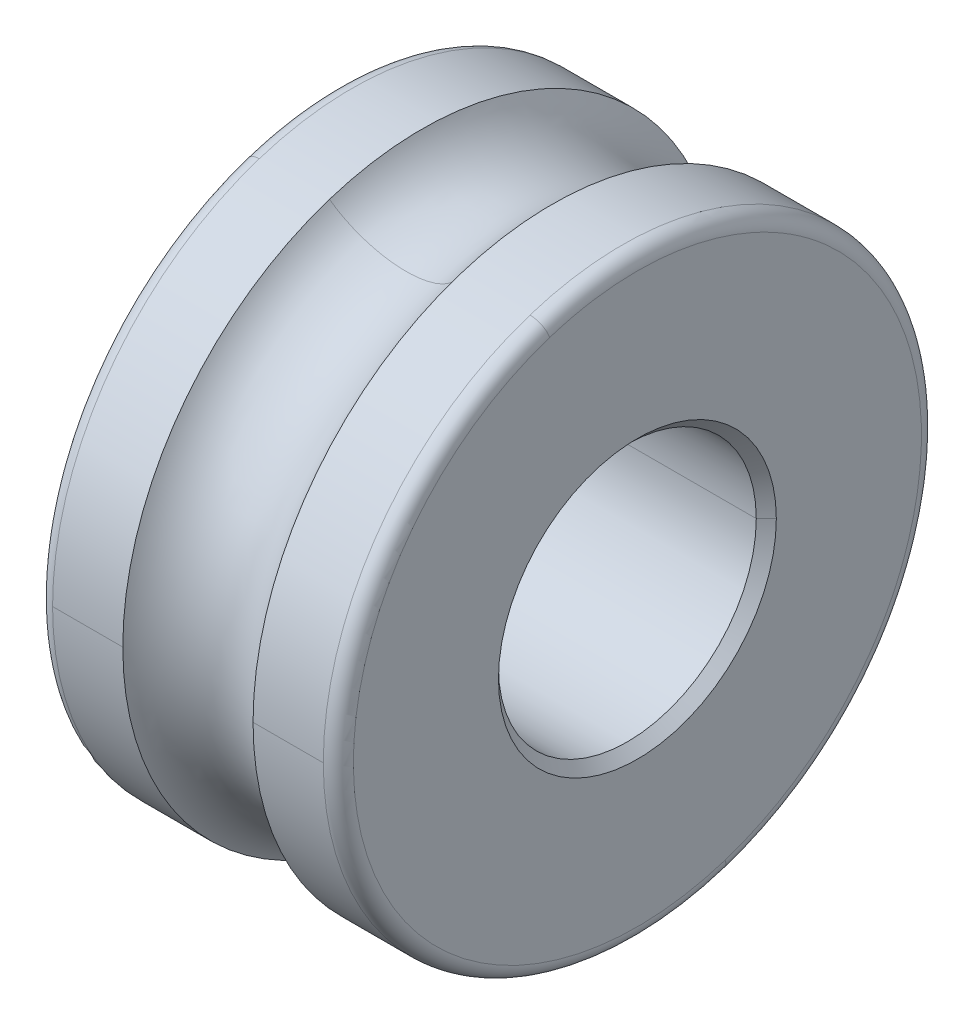
ISO-10303-21;
HEADER;
FILE_DESCRIPTION(('STEP AP214'),'2;1');
FILE_NAME('part.step','',(''),(''),'','','');
FILE_SCHEMA(('AUTOMOTIVE_DESIGN { 1 0 10303 214 1 1 1 1 }'));
ENDSEC;
DATA;
#1=APPLICATION_CONTEXT('core data for automotive mechanical design processes');
#2=APPLICATION_PROTOCOL_DEFINITION('international standard','automotive_design',2000,#1);
#3=PRODUCT_CONTEXT('',#1,'mechanical');
#4=PRODUCT('Part','Part','',(#3));
#5=PRODUCT_RELATED_PRODUCT_CATEGORY('part','',(#4));
#6=PRODUCT_DEFINITION_FORMATION('','',#4);
#7=PRODUCT_DEFINITION_CONTEXT('part definition',#1,'design');
#8=PRODUCT_DEFINITION('design','',#6,#7);
#9=PRODUCT_DEFINITION_SHAPE('','',#8);
#10=(LENGTH_UNIT() NAMED_UNIT(*) SI_UNIT(.MILLI.,.METRE.));
#11=(NAMED_UNIT(*) PLANE_ANGLE_UNIT() SI_UNIT($,.RADIAN.));
#12=(NAMED_UNIT(*) SI_UNIT($,.STERADIAN.) SOLID_ANGLE_UNIT());
#13=UNCERTAINTY_MEASURE_WITH_UNIT(LENGTH_MEASURE(1.E-05),#10,'distance_accuracy_value','');
#14=(GEOMETRIC_REPRESENTATION_CONTEXT(3) GLOBAL_UNCERTAINTY_ASSIGNED_CONTEXT((#13)) GLOBAL_UNIT_ASSIGNED_CONTEXT((#10,
#11,#12)) REPRESENTATION_CONTEXT('',''));
#15=CARTESIAN_POINT('',(0.,0.,0.));
#16=DIRECTION('',(0.,0.,1.));
#17=DIRECTION('',(1.,0.,0.));
#18=AXIS2_PLACEMENT_3D('',#15,#16,#17);
#19=CARTESIAN_POINT('',(0.,6.61,0.));
#20=DIRECTION('',(-1.,0.,0.));
#21=DIRECTION('',(0.,0.,1.));
#22=AXIS2_PLACEMENT_3D('',#19,#20,#21);
#23=PLANE('',#22);
#24=CARTESIAN_POINT('',(0.,0.,0.));
#25=DIRECTION('',(1.,0.,0.));
#26=DIRECTION('',(0.,0.,-1.));
#27=AXIS2_PLACEMENT_3D('',#24,#25,#26);
#28=CIRCLE('',#27,3.2333333333333);
#29=CARTESIAN_POINT('',(0.,0.,-3.2333333333333));
#30=VERTEX_POINT('',#29);
#31=CARTESIAN_POINT('',(0.,0.,3.2333333333333));
#32=VERTEX_POINT('',#31);
#33=EDGE_CURVE('E11',#30,#32,#28,.T.);
#34=ORIENTED_EDGE('',*,*,#33,.T.);
#35=CARTESIAN_POINT('',(0.,0.,0.));
#36=DIRECTION('',(1.,0.,0.));
#37=DIRECTION('',(0.,0.,-1.));
#38=AXIS2_PLACEMENT_3D('',#35,#36,#37);
#39=CIRCLE('',#38,3.2333333333333);
#40=EDGE_CURVE('E25',#32,#30,#39,.T.);
#41=ORIENTED_EDGE('',*,*,#40,.T.);
#42=EDGE_LOOP('',(#34,#41));
#43=FACE_BOUND('',#42,.T.);
#44=CARTESIAN_POINT('',(0.,6.28648357271096,2.04260233281842));
#45=CARTESIAN_POINT('',(0.,6.25306371841246,2.14546549257869));
#46=CARTESIAN_POINT('',(0.,6.2171150163583,2.2475067746292));
#47=CARTESIAN_POINT('',(0.,6.14025594741172,2.44970334029793));
#48=CARTESIAN_POINT('',(0.,6.09934558051929,2.54985862391613));
#49=CARTESIAN_POINT('',(0.,6.01265921256923,2.74804094970742));
#50=CARTESIAN_POINT('',(0.,5.9668832115116,2.8460679918805));
#51=CARTESIAN_POINT('',(0.,5.87057653046257,3.03975793632542));
#52=CARTESIAN_POINT('',(0.,5.82004585047117,3.13542083859726));
#53=CARTESIAN_POINT('',(0.,5.71435136303119,3.32415197399251));
#54=CARTESIAN_POINT('',(0.,5.65918755558261,3.41722020711593));
#55=CARTESIAN_POINT('',(0.,5.54435975626676,3.60053781316041));
#56=CARTESIAN_POINT('',(0.,5.4846957643995,3.69078718608148));
#57=CARTESIAN_POINT('',(0.,5.36101131900778,3.86824964812758));
#58=CARTESIAN_POINT('',(0.,5.29699086548332,3.9554627372526));
#59=CARTESIAN_POINT('',(0.,5.1647477311462,4.12664252906214));
#60=CARTESIAN_POINT('',(0.,5.09652505033354,4.21060923174664));
#61=CARTESIAN_POINT('',(0.,4.95604181489885,4.37509396717841));
#62=CARTESIAN_POINT('',(0.,4.88378126027682,4.45561199992567));
#63=CARTESIAN_POINT('',(0.,4.73539635947924,4.61300542058471));
#64=CARTESIAN_POINT('',(0.,4.65927201330369,4.68988080849649));
#65=CARTESIAN_POINT('',(0.,4.5033429195496,4.83980373991612));
#66=CARTESIAN_POINT('',(0.,4.42353817197105,4.91285128342395));
#67=CARTESIAN_POINT('',(0.,4.26044053205593,5.05494254811199));
#68=CARTESIAN_POINT('',(0.,4.17714763971937,5.12398626929219));
#69=CARTESIAN_POINT('',(0.,4.00727437015662,5.25790355695128));
#70=CARTESIAN_POINT('',(0.,3.92069399293044,5.32277712343018));
#71=CARTESIAN_POINT('',(0.,3.74445433330205,5.44819781558325));
#72=CARTESIAN_POINT('',(0.,3.65479505089984,5.50874494125743));
#73=CARTESIAN_POINT('',(0.,3.47261357798356,5.62536688847189));
#74=CARTESIAN_POINT('',(0.,3.3800913874695,5.68144171001218));
#75=CARTESIAN_POINT('',(0.,3.19240699239056,5.78898395980221));
#76=CARTESIAN_POINT('',(0.,3.09724478782568,5.84045138805197));
#77=CARTESIAN_POINT('',(0.,2.9045096187311,5.93865486171827));
#78=CARTESIAN_POINT('',(0.,2.8069366542014,5.98539090713482));
#79=CARTESIAN_POINT('',(0.,2.60961502699511,6.07401902390771));
#80=CARTESIAN_POINT('',(0.,2.50986636431852,6.11591109526406));
#81=CARTESIAN_POINT('',(0.,2.30843364408381,6.19475034224733));
#82=CARTESIAN_POINT('',(0.,2.20674958652568,6.23169751787426));
#83=CARTESIAN_POINT('',(0.,2.001691042329,6.30055796441643));
#84=CARTESIAN_POINT('',(0.,1.89831655569046,6.33247123533167));
#85=CARTESIAN_POINT('',(0.,1.6901261915258,6.39118699058555));
#86=CARTESIAN_POINT('',(0.,1.58531031399969,6.41798947492419));
#87=CARTESIAN_POINT('',(0.,1.37448967868964,6.46641908749249));
#88=CARTESIAN_POINT('',(0.,1.2684849209057,6.48804621572214));
#89=CARTESIAN_POINT('',(0.,1.05554189982644,6.52607301442623));
#90=CARTESIAN_POINT('',(0.,0.948603636531105,6.54247268490068));
#91=CARTESIAN_POINT('',(0.,0.734051228072004,6.57000505985174));
#92=CARTESIAN_POINT('',(0.,0.626437082908237,6.58113776432836));
#93=CARTESIAN_POINT('',(0.,0.410792162613851,6.59810938762359));
#94=CARTESIAN_POINT('',(0.,0.302761387483233,6.6039483064422));
#95=CARTESIAN_POINT('',(0.,0.0865434628548161,6.61031829195453));
#96=CARTESIAN_POINT('',(0.,-0.0216436866429828,6.61084935864825));
#97=CARTESIAN_POINT('',(0.,-0.237913727686547,6.60660236052464));
#98=CARTESIAN_POINT('',(0.,-0.345996619232311,6.60182429570731));
#99=CARTESIAN_POINT('',(0.,-0.561797763219132,6.58697054533824));
#100=CARTESIAN_POINT('',(0.,-0.669516015660187,6.5768948597865));
#101=CARTESIAN_POINT('',(0.,-0.88432837873245,6.55147014115763));
#102=CARTESIAN_POINT('',(0.,-0.991422489363659,6.5361211080805));
#103=CARTESIAN_POINT('',(0.,-1.20472856972338,6.50018667156596));
#104=CARTESIAN_POINT('',(0.,-1.3109405394519,6.47960126812855));
#105=CARTESIAN_POINT('',(0.,-1.52222646406809,6.43324368293338));
#106=CARTESIAN_POINT('',(0.,-1.62730041895577,6.40747150117563));
#107=CARTESIAN_POINT('',(0.,-1.83605718152957,6.35080244678302));
#108=CARTESIAN_POINT('',(0.,-1.9397399892157,6.31990557414816));
#109=CARTESIAN_POINT('',(0.,-2.14546467642113,6.25306157127376));
#110=CARTESIAN_POINT('',(0.,-2.24750655594044,6.21711444103422));
#111=CARTESIAN_POINT('',(0.,-2.44970355898668,6.1402565227358));
#112=CARTESIAN_POINT('',(0.,-2.5498586825136,6.09934573467692));
#113=CARTESIAN_POINT('',(0.,-2.74804089110994,6.01265905841161));
#114=CARTESIAN_POINT('',(0.,-2.84606797617935,5.96688317020519));
#115=CARTESIAN_POINT('',(0.,-3.03975795202656,5.87057657176898));
#116=CARTESIAN_POINT('',(0.,-3.13542084280436,5.82004586153919));
#117=CARTESIAN_POINT('',(0.,-3.3241519697854,5.71435135196317));
#118=CARTESIAN_POINT('',(0.,-3.41722020598863,5.65918755261694));
#119=CARTESIAN_POINT('',(0.,-3.6005378142877,5.54435975923243));
#120=CARTESIAN_POINT('',(0.,-3.69078718638354,5.48469576519415));
#121=CARTESIAN_POINT('',(0.,-3.86824964782552,5.36101131821313));
#122=CARTESIAN_POINT('',(0.,-3.95546273717166,5.29699086527039));
#123=CARTESIAN_POINT('',(0.,-4.12664252914307,5.16474773135913));
#124=CARTESIAN_POINT('',(0.,-4.21060923176833,5.0965250503906));
#125=CARTESIAN_POINT('',(0.,-4.37509396715672,4.9560418148418));
#126=CARTESIAN_POINT('',(0.,-4.45561199991985,4.88378126026154));
#127=CARTESIAN_POINT('',(0.,-4.61300542059051,4.73539635949453));
#128=CARTESIAN_POINT('',(0.,-4.68988080849805,4.65927201330779));
#129=CARTESIAN_POINT('',(0.,-4.83980373991455,4.5033429195455));
#130=CARTESIAN_POINT('',(0.,-4.91285128342353,4.42353817196996));
#131=CARTESIAN_POINT('',(0.,-5.0549425481124,4.26044053205704));
#132=CARTESIAN_POINT('',(0.,-5.12398626929229,4.17714763971966));
#133=CARTESIAN_POINT('',(0.,-5.25790355695117,4.00727437015633));
#134=CARTESIAN_POINT('',(0.,-5.32277712343014,3.92069399293037));
#135=CARTESIAN_POINT('',(0.,-5.44819781558328,3.74445433330213));
#136=CARTESIAN_POINT('',(0.,-5.50874494125744,3.65479505089986));
#137=CARTESIAN_POINT('',(0.,-5.62536688847188,3.47261357798355));
#138=CARTESIAN_POINT('',(0.,-5.68144171001217,3.3800913874695));
#139=CARTESIAN_POINT('',(0.,-5.78898395980221,3.19240699239058));
#140=CARTESIAN_POINT('',(0.,-5.84045138805196,3.09724478782569));
#141=CARTESIAN_POINT('',(0.,-5.93865486171827,2.90450961873111));
#142=CARTESIAN_POINT('',(0.,-5.98539090713481,2.80693665420141));
#143=CARTESIAN_POINT('',(0.,-6.07401902390772,2.60961502699511));
#144=CARTESIAN_POINT('',(0.,-6.11591109526408,2.50986636431852));
#145=CARTESIAN_POINT('',(0.,-6.19475034224731,2.30843364408382));
#146=CARTESIAN_POINT('',(0.,-6.23169751787418,2.20674958652571));
#147=CARTESIAN_POINT('',(0.,-6.30055796441651,2.00169104232899));
#148=CARTESIAN_POINT('',(0.,-6.33247123533197,1.89831655569038));
#149=CARTESIAN_POINT('',(0.,-6.39118699058525,1.69012619152589));
#150=CARTESIAN_POINT('',(0.,-6.41798947492306,1.585310314));
#151=CARTESIAN_POINT('',(0.,-6.46641908749362,1.37448967868934));
#152=CARTESIAN_POINT('',(0.,-6.48804621572637,1.26848492090456));
#153=CARTESIAN_POINT('',(0.,-6.526073014422,1.05554189982759));
#154=CARTESIAN_POINT('',(0.,-6.54247268488489,0.948603636535395));
#155=CARTESIAN_POINT('',(0.,-6.57000505986753,0.734051228067723));
#156=CARTESIAN_POINT('',(0.,-6.58113776438727,0.62643708289225));
#157=CARTESIAN_POINT('',(0.,-6.59810938756469,0.410792162629845));
#158=CARTESIAN_POINT('',(0.,-6.60394830622236,0.302761387542914));
#159=CARTESIAN_POINT('',(0.,-6.61031829217436,0.0865434627951466));
#160=CARTESIAN_POINT('',(0.,-6.61084935946868,-0.0216436868656896));
#161=CARTESIAN_POINT('',(0.,-6.60660235970422,-0.237913727463827));
#162=CARTESIAN_POINT('',(0.,-6.60182429264543,-0.345996618401128));
#163=CARTESIAN_POINT('',(0.,-6.58697054840012,-0.561797764050303));
#164=CARTESIAN_POINT('',(0.,-6.57689487121359,-0.669516018762178));
#165=CARTESIAN_POINT('',(0.,-6.55147012973054,-0.884328375630452));
#166=CARTESIAN_POINT('',(0.,-6.53612106543401,-0.991422477786851));
#167=CARTESIAN_POINT('',(0.,-6.50018671421245,-1.20472858130018));
#168=CARTESIAN_POINT('',(0.,-6.47960142728742,-1.31094058265712));
#169=CARTESIAN_POINT('',(0.,-6.43324352377452,-1.52222642086287));
#170=CARTESIAN_POINT('',(0.,-6.40747090718665,-1.62730025771168));
#171=CARTESIAN_POINT('',(0.,-6.35080304077201,-1.83605734277366));
#172=CARTESIAN_POINT('',(0.,-6.31990779094523,-1.93974059098682));
#173=CARTESIAN_POINT('',(0.,-6.28648357271096,-2.04260233281841));
#174=B_SPLINE_CURVE_WITH_KNOTS('',3,(#44,#45,#46,#47,#48,#49,#50,#51,#52,#53,#54,#55,#56,#57,
#58,#59,#60,#61,#62,#63,#64,#65,#66,#67,#68,#69,#70,#71,#72,#73,#74,#75,#76,#77,#78,#79,#80,#81,
#82,#83,#84,#85,#86,#87,#88,#89,#90,#91,#92,#93,#94,#95,#96,#97,#98,#99,#100,#101,#102,#103,
#104,#105,#106,#107,#108,#109,#110,#111,#112,#113,#114,#115,#116,#117,#118,#119,#120,#121,#122,
#123,#124,#125,#126,#127,#128,#129,#130,#131,#132,#133,#134,#135,#136,#137,#138,#139,#140,#141,
#142,#143,#144,#145,#146,#147,#148,#149,#150,#151,#152,#153,#154,#155,#156,#157,#158,#159,#160,
#161,#162,#163,#164,#165,#166,#167,#168,#169,#170,#171,#172,#173),.UNSPECIFIED.,.F.,.F.,(4,2,2,
2,2,2,2,2,2,2,2,2,2,2,2,2,2,2,2,2,2,2,2,2,2,2,2,2,2,2,2,2,2,2,2,2,2,2,2,2,2,2,2,2,2,2,2,2,2,2,2,
2,2,2,2,2,2,2,2,2,2,2,2,2,4),(0.,0.324435041072899,0.648870082145801,0.973305123218701,
1.2977401642916,1.6221752053645,1.9466102464374,2.2710452875103,2.5954803285832,2.9199153696561,
3.244350410729,3.56878545180191,3.8932204928748,4.2176555339477,4.5420905750206,
4.86652561609351,5.19096065716641,5.51539569823931,5.83983073931221,6.16426578038511,
6.48870082145801,6.81313586253091,7.13757090360381,7.46200594467671,7.78644098574961,
8.11087602682251,8.43531106789541,8.75974610896831,9.08418115004121,9.40861619111411,
9.73305123218701,10.0574862732599,10.3819213143328,10.7063563554057,11.0307913964786,
11.3552264375515,11.6796614786244,12.0040965196973,12.3285315607702,12.6529666018431,
12.977401642916,13.3018366839889,13.6262717250618,13.9507067661347,14.2751418072076,
14.5995768482805,14.9240118893534,15.2484469304263,15.5728819714992,15.8973170125721,
16.221752053645,16.5461870947179,16.8706221357908,17.1950571768637,17.5194922179366,
17.8439272590095,18.1683623000824,18.4927973411553,18.8172323822282,19.1416674233011,
19.466102464374,19.7905375054469,20.1149725465198,20.4394075875927,20.7638426286656),.UNSPECIFIED.);
#175=CARTESIAN_POINT('',(0.,6.28648357271097,2.0426023328184));
#176=VERTEX_POINT('',#175);
#177=CARTESIAN_POINT('',(0.,-6.28648357271097,-2.0426023328184));
#178=VERTEX_POINT('',#177);
#179=EDGE_CURVE('E348',#176,#178,#174,.T.);
#180=ORIENTED_EDGE('',*,*,#179,.F.);
#181=CARTESIAN_POINT('',(0.,-6.28648357271096,-2.04260233281842));
#182=CARTESIAN_POINT('',(0.,-6.25306371841246,-2.14546549257869));
#183=CARTESIAN_POINT('',(0.,-6.2171150163583,-2.2475067746292));
#184=CARTESIAN_POINT('',(0.,-6.14025594741172,-2.44970334029793));
#185=CARTESIAN_POINT('',(0.,-6.09934558051929,-2.54985862391613));
#186=CARTESIAN_POINT('',(0.,-6.01265921256923,-2.74804094970742));
#187=CARTESIAN_POINT('',(0.,-5.9668832115116,-2.8460679918805));
#188=CARTESIAN_POINT('',(0.,-5.87057653046257,-3.03975793632542));
#189=CARTESIAN_POINT('',(0.,-5.82004585047117,-3.13542083859726));
#190=CARTESIAN_POINT('',(0.,-5.71435136303119,-3.32415197399251));
#191=CARTESIAN_POINT('',(0.,-5.65918755558261,-3.41722020711593));
#192=CARTESIAN_POINT('',(0.,-5.54435975626676,-3.60053781316041));
#193=CARTESIAN_POINT('',(0.,-5.4846957643995,-3.69078718608148));
#194=CARTESIAN_POINT('',(0.,-5.36101131900778,-3.86824964812758));
#195=CARTESIAN_POINT('',(0.,-5.29699086548332,-3.9554627372526));
#196=CARTESIAN_POINT('',(0.,-5.1647477311462,-4.12664252906213));
#197=CARTESIAN_POINT('',(0.,-5.09652505033354,-4.21060923174664));
#198=CARTESIAN_POINT('',(0.,-4.95604181489886,-4.37509396717841));
#199=CARTESIAN_POINT('',(0.,-4.88378126027682,-4.45561199992566));
#200=CARTESIAN_POINT('',(0.,-4.73539635947924,-4.6130054205847));
#201=CARTESIAN_POINT('',(0.,-4.65927201330369,-4.68988080849649));
#202=CARTESIAN_POINT('',(0.,-4.5033429195496,-4.83980373991611));
#203=CARTESIAN_POINT('',(0.,-4.42353817197105,-4.91285128342395));
#204=CARTESIAN_POINT('',(0.,-4.26044053205594,-5.05494254811198));
#205=CARTESIAN_POINT('',(0.,-4.17714763971937,-5.12398626929218));
#206=CARTESIAN_POINT('',(0.,-4.00727437015662,-5.25790355695128));
#207=CARTESIAN_POINT('',(0.,-3.92069399293044,-5.32277712343017));
#208=CARTESIAN_POINT('',(0.,-3.74445433330205,-5.44819781558325));
#209=CARTESIAN_POINT('',(0.,-3.65479505089984,-5.50874494125743));
#210=CARTESIAN_POINT('',(0.,-3.47261357798357,-5.62536688847189));
#211=CARTESIAN_POINT('',(0.,-3.38009138746951,-5.68144171001217));
#212=CARTESIAN_POINT('',(0.,-3.19240699239057,-5.78898395980221));
#213=CARTESIAN_POINT('',(0.,-3.09724478782569,-5.84045138805196));
#214=CARTESIAN_POINT('',(0.,-2.90450961873111,-5.93865486171827));
#215=CARTESIAN_POINT('',(0.,-2.8069366542014,-5.98539090713482));
#216=CARTESIAN_POINT('',(0.,-2.60961502699512,-6.07401902390771));
#217=CARTESIAN_POINT('',(0.,-2.50986636431853,-6.11591109526406));
#218=CARTESIAN_POINT('',(0.,-2.30843364408382,-6.19475034224733));
#219=CARTESIAN_POINT('',(0.,-2.20674958652569,-6.23169751787426));
#220=CARTESIAN_POINT('',(0.,-2.00169104232901,-6.30055796441643));
#221=CARTESIAN_POINT('',(0.,-1.89831655569047,-6.33247123533167));
#222=CARTESIAN_POINT('',(0.,-1.69012619152581,-6.39118699058555));
#223=CARTESIAN_POINT('',(0.,-1.58531031399969,-6.41798947492419));
#224=CARTESIAN_POINT('',(0.,-1.37448967868965,-6.46641908749249));
#225=CARTESIAN_POINT('',(0.,-1.26848492090571,-6.48804621572214));
#226=CARTESIAN_POINT('',(0.,-1.05554189982645,-6.52607301442623));
#227=CARTESIAN_POINT('',(0.,-0.948603636531112,-6.54247268490068));
#228=CARTESIAN_POINT('',(0.,-0.73405122807201,-6.57000505985174));
#229=CARTESIAN_POINT('',(0.,-0.626437082908244,-6.58113776432836));
#230=CARTESIAN_POINT('',(0.,-0.41079216261386,-6.59810938762359));
#231=CARTESIAN_POINT('',(0.,-0.302761387483243,-6.6039483064422));
#232=CARTESIAN_POINT('',(0.,-0.0865434628548261,-6.61031829195453));
#233=CARTESIAN_POINT('',(0.,0.0216436866429738,-6.61084935864825));
#234=CARTESIAN_POINT('',(0.,0.237913727686538,-6.60660236052465));
#235=CARTESIAN_POINT('',(0.,0.345996619232303,-6.60182429570731));
#236=CARTESIAN_POINT('',(0.,0.561797763219122,-6.58697054533824));
#237=CARTESIAN_POINT('',(0.,0.669516015660177,-6.5768948597865));
#238=CARTESIAN_POINT('',(0.,0.884328378732439,-6.55147014115763));
#239=CARTESIAN_POINT('',(0.,0.991422489363648,-6.5361211080805));
#240=CARTESIAN_POINT('',(0.,1.20472856972337,-6.50018667156596));
#241=CARTESIAN_POINT('',(0.,1.31094053945189,-6.47960126812855));
#242=CARTESIAN_POINT('',(0.,1.52222646406808,-6.43324368293338));
#243=CARTESIAN_POINT('',(0.,1.62730041895576,-6.40747150117563));
#244=CARTESIAN_POINT('',(0.,1.83605718152956,-6.35080244678302));
#245=CARTESIAN_POINT('',(0.,1.93973998921569,-6.31990557414817));
#246=CARTESIAN_POINT('',(0.,2.14546467642112,-6.25306157127377));
#247=CARTESIAN_POINT('',(0.,2.24750655594043,-6.21711444103422));
#248=CARTESIAN_POINT('',(0.,2.44970355898667,-6.1402565227358));
#249=CARTESIAN_POINT('',(0.,2.54985868251359,-6.09934573467692));
#250=CARTESIAN_POINT('',(0.,2.74804089110993,-6.01265905841162));
#251=CARTESIAN_POINT('',(0.,2.84606797617934,-5.96688317020519));
#252=CARTESIAN_POINT('',(0.,3.03975795202655,-5.87057657176898));
#253=CARTESIAN_POINT('',(0.,3.13542084280435,-5.8200458615392));
#254=CARTESIAN_POINT('',(0.,3.32415196978539,-5.71435135196318));
#255=CARTESIAN_POINT('',(0.,3.41722020598862,-5.65918755261695));
#256=CARTESIAN_POINT('',(0.,3.60053781428769,-5.54435975923244));
#257=CARTESIAN_POINT('',(0.,3.69078718638352,-5.48469576519416));
#258=CARTESIAN_POINT('',(0.,3.86824964782551,-5.36101131821314));
#259=CARTESIAN_POINT('',(0.,3.95546273717165,-5.2969908652704));
#260=CARTESIAN_POINT('',(0.,4.12664252914306,-5.16474773135913));
#261=CARTESIAN_POINT('',(0.,4.21060923176832,-5.0965250503906));
#262=CARTESIAN_POINT('',(0.,4.37509396715671,-4.95604181484181));
#263=CARTESIAN_POINT('',(0.,4.45561199991984,-4.88378126026154));
#264=CARTESIAN_POINT('',(0.,4.61300542059051,-4.73539635949454));
#265=CARTESIAN_POINT('',(0.,4.68988080849804,-4.6592720133078));
#266=CARTESIAN_POINT('',(0.,4.83980373991455,-4.50334291954551));
#267=CARTESIAN_POINT('',(0.,4.91285128342352,-4.42353817196996));
#268=CARTESIAN_POINT('',(0.,5.05494254811239,-4.26044053205705));
#269=CARTESIAN_POINT('',(0.,5.12398626929229,-4.17714763971967));
#270=CARTESIAN_POINT('',(0.,5.25790355695116,-4.00727437015634));
#271=CARTESIAN_POINT('',(0.,5.32277712343013,-3.92069399293038));
#272=CARTESIAN_POINT('',(0.,5.44819781558327,-3.74445433330214));
#273=CARTESIAN_POINT('',(0.,5.50874494125743,-3.65479505089987));
#274=CARTESIAN_POINT('',(0.,5.62536688847187,-3.47261357798356));
#275=CARTESIAN_POINT('',(0.,5.68144171001216,-3.38009138746952));
#276=CARTESIAN_POINT('',(0.,5.7889839598022,-3.19240699239059));
#277=CARTESIAN_POINT('',(0.,5.84045138805196,-3.0972447878257));
#278=CARTESIAN_POINT('',(0.,5.93865486171826,-2.90450961873112));
#279=CARTESIAN_POINT('',(0.,5.98539090713481,-2.80693665420142));
#280=CARTESIAN_POINT('',(0.,6.07401902390771,-2.60961502699513));
#281=CARTESIAN_POINT('',(0.,6.11591109526407,-2.50986636431854));
#282=CARTESIAN_POINT('',(0.,6.1947503422473,-2.30843364408384));
#283=CARTESIAN_POINT('',(0.,6.23169751787417,-2.20674958652573));
#284=CARTESIAN_POINT('',(0.,6.30055796441651,-2.001691042329));
#285=CARTESIAN_POINT('',(0.,6.33247123533197,-1.8983165556904));
#286=CARTESIAN_POINT('',(0.,6.39118699058524,-1.6901261915259));
#287=CARTESIAN_POINT('',(0.,6.41798947492306,-1.58531031400001));
#288=CARTESIAN_POINT('',(0.,6.46641908749362,-1.37448967868935));
#289=CARTESIAN_POINT('',(0.,6.48804621572636,-1.26848492090458));
#290=CARTESIAN_POINT('',(0.,6.526073014422,-1.05554189982761));
#291=CARTESIAN_POINT('',(0.,6.54247268488489,-0.948603636535412));
#292=CARTESIAN_POINT('',(0.,6.57000505986752,-0.734051228067743));
#293=CARTESIAN_POINT('',(0.,6.58113776438727,-0.62643708289227));
#294=CARTESIAN_POINT('',(0.,6.59810938756469,-0.410792162629865));
#295=CARTESIAN_POINT('',(0.,6.60394830622236,-0.302761387542934));
#296=CARTESIAN_POINT('',(0.,6.61031829217436,-0.0865434627951661));
#297=CARTESIAN_POINT('',(0.,6.61084935946868,0.0216436868656699));
#298=CARTESIAN_POINT('',(0.,6.60660235970422,0.237913727463807));
#299=CARTESIAN_POINT('',(0.,6.60182429264543,0.345996618401108));
#300=CARTESIAN_POINT('',(0.,6.58697054840012,0.561797764050283));
#301=CARTESIAN_POINT('',(0.,6.57689487121359,0.669516018762158));
#302=CARTESIAN_POINT('',(0.,6.55147012973054,0.884328375630432));
#303=CARTESIAN_POINT('',(0.,6.53612106543402,0.991422477786831));
#304=CARTESIAN_POINT('',(0.,6.50018671421246,1.20472858130016));
#305=CARTESIAN_POINT('',(0.,6.47960142728742,1.3109405826571));
#306=CARTESIAN_POINT('',(0.,6.43324352377452,1.52222642086285));
#307=CARTESIAN_POINT('',(0.,6.40747090718665,1.62730025771166));
#308=CARTESIAN_POINT('',(0.,6.35080304077201,1.83605734277364));
#309=CARTESIAN_POINT('',(0.,6.31990779094524,1.9397405909868));
#310=CARTESIAN_POINT('',(0.,6.28648357271097,2.04260233281839));
#311=B_SPLINE_CURVE_WITH_KNOTS('',3,(#181,#182,#183,#184,#185,#186,#187,#188,#189,#190,#191,
#192,#193,#194,#195,#196,#197,#198,#199,#200,#201,#202,#203,#204,#205,#206,#207,#208,#209,#210,
#211,#212,#213,#214,#215,#216,#217,#218,#219,#220,#221,#222,#223,#224,#225,#226,#227,#228,#229,
#230,#231,#232,#233,#234,#235,#236,#237,#238,#239,#240,#241,#242,#243,#244,#245,#246,#247,#248,
#249,#250,#251,#252,#253,#254,#255,#256,#257,#258,#259,#260,#261,#262,#263,#264,#265,#266,#267,
#268,#269,#270,#271,#272,#273,#274,#275,#276,#277,#278,#279,#280,#281,#282,#283,#284,#285,#286,
#287,#288,#289,#290,#291,#292,#293,#294,#295,#296,#297,#298,#299,#300,#301,#302,#303,#304,#305,
#306,#307,#308,#309,#310),.UNSPECIFIED.,.F.,.F.,(4,2,2,2,2,2,2,2,2,2,2,2,2,2,2,2,2,2,2,2,2,2,2,
2,2,2,2,2,2,2,2,2,2,2,2,2,2,2,2,2,2,2,2,2,2,2,2,2,2,2,2,2,2,2,2,2,2,2,2,2,2,2,2,2,4),(0.,
0.3244350410729,0.648870082145801,0.9733051232187,1.2977401642916,1.6221752053645,
1.9466102464374,2.2710452875103,2.5954803285832,2.9199153696561,3.244350410729,3.5687854518019,
3.8932204928748,4.2176555339477,4.5420905750206,4.8665256160935,5.1909606571664,5.5153956982393,
5.8398307393122,6.1642657803851,6.488700821458,6.8131358625309,7.1375709036038,7.4620059446767,
7.7864409857496,8.1108760268225,8.4353110678954,8.7597461089683,9.0841811500412,9.4086161911141,
9.733051232187,10.0574862732599,10.3819213143328,10.7063563554057,11.0307913964786,
11.3552264375515,11.6796614786244,12.0040965196973,12.3285315607702,12.6529666018431,
12.977401642916,13.3018366839889,13.6262717250618,13.9507067661347,14.2751418072076,
14.5995768482805,14.9240118893534,15.2484469304263,15.5728819714992,15.8973170125721,
16.221752053645,16.5461870947179,16.8706221357908,17.1950571768637,17.5194922179366,
17.8439272590095,18.1683623000824,18.4927973411553,18.8172323822282,19.1416674233011,
19.466102464374,19.7905375054469,20.1149725465198,20.4394075875927,20.7638426286656),.UNSPECIFIED.);
#312=EDGE_CURVE('E323',#178,#176,#311,.T.);
#313=ORIENTED_EDGE('',*,*,#312,.F.);
#314=EDGE_LOOP('',(#180,#313));
#315=FACE_BOUND('',#314,.T.);
#316=ADVANCED_FACE('F16',(#43,#315),#23,.T.);
#317=CARTESIAN_POINT('',(0.349999999999988,0.,0.));
#318=DIRECTION('',(1.,0.,0.));
#319=DIRECTION('',(0.,-0.309016994374947,0.951056516295154));
#320=AXIS2_PLACEMENT_3D('',#317,#318,#319);
#321=TOROIDAL_SURFACE('',#320,6.61,0.349999999999988);
#322=CARTESIAN_POINT('',(0.349999999999988,-6.28648357271097,-2.0426023328184));
#323=DIRECTION('',(0.,0.309016994374947,-0.951056516295154));
#324=DIRECTION('',(0.,-0.951056516295154,-0.309016994374947));
#325=AXIS2_PLACEMENT_3D('',#322,#323,#324);
#326=CIRCLE('',#325,0.349999999999987);
#327=CARTESIAN_POINT('',(0.35,-6.61935335341426,-2.15075828084963));
#328=VERTEX_POINT('',#327);
#329=EDGE_CURVE('E324',#328,#178,#326,.T.);
#330=ORIENTED_EDGE('',*,*,#329,.T.);
#331=ORIENTED_EDGE('',*,*,#312,.T.);
#332=CARTESIAN_POINT('',(0.349999999999988,6.28648357271097,2.0426023328184));
#333=DIRECTION('',(0.,-0.309016994374947,0.951056516295154));
#334=DIRECTION('',(0.,0.951056516295154,0.309016994374947));
#335=AXIS2_PLACEMENT_3D('',#332,#333,#334);
#336=CIRCLE('',#335,0.349999999999987);
#337=CARTESIAN_POINT('',(0.35,6.61935335341426,2.15075828084963));
#338=VERTEX_POINT('',#337);
#339=EDGE_CURVE('E326',#338,#176,#336,.T.);
#340=ORIENTED_EDGE('',*,*,#339,.F.);
#341=CARTESIAN_POINT('',(0.35,0.,0.));
#342=DIRECTION('',(1.,0.,0.));
#343=DIRECTION('',(0.,0.,-1.));
#344=AXIS2_PLACEMENT_3D('',#341,#342,#343);
#345=CIRCLE('',#344,6.96);
#346=CARTESIAN_POINT('',(0.35,0.,-6.96));
#347=VERTEX_POINT('',#346);
#348=EDGE_CURVE('E357',#347,#338,#345,.T.);
#349=ORIENTED_EDGE('',*,*,#348,.F.);
#350=CARTESIAN_POINT('',(0.35,0.,0.));
#351=DIRECTION('',(1.,0.,0.));
#352=DIRECTION('',(0.,0.,-1.));
#353=AXIS2_PLACEMENT_3D('',#350,#351,#352);
#354=CIRCLE('',#353,6.96);
#355=EDGE_CURVE('E358',#328,#347,#354,.T.);
#356=ORIENTED_EDGE('',*,*,#355,.F.);
#357=EDGE_LOOP('',(#330,#331,#340,#349,#356));
#358=FACE_BOUND('',#357,.T.);
#359=ADVANCED_FACE('F303',(#358),#321,.T.);
#360=CARTESIAN_POINT('',(7.,0.,0.));
#361=DIRECTION('',(1.,0.,0.));
#362=DIRECTION('',(0.,1.,0.));
#363=AXIS2_PLACEMENT_3D('',#360,#361,#362);
#364=CYLINDRICAL_SURFACE('',#363,6.96);
#365=DIRECTION('',(1.,0.,0.));
#366=VECTOR('',#365,1.);
#367=CARTESIAN_POINT('',(0.35,0.,6.96));
#368=LINE('',#367,#366);
#369=CARTESIAN_POINT('',(0.35,0.,6.96));
#370=VERTEX_POINT('',#369);
#371=CARTESIAN_POINT('',(1.9844555433772,0.,6.96));
#372=VERTEX_POINT('',#371);
#373=EDGE_CURVE('E367',#370,#372,#368,.T.);
#374=ORIENTED_EDGE('',*,*,#373,.F.);
#375=CARTESIAN_POINT('',(0.35,0.,0.));
#376=DIRECTION('',(1.,0.,0.));
#377=DIRECTION('',(0.,0.,-1.));
#378=AXIS2_PLACEMENT_3D('',#375,#376,#377);
#379=CIRCLE('',#378,6.96);
#380=EDGE_CURVE('E372',#370,#328,#379,.T.);
#381=ORIENTED_EDGE('',*,*,#380,.T.);
#382=ORIENTED_EDGE('',*,*,#355,.T.);
#383=DIRECTION('',(1.,0.,0.));
#384=VECTOR('',#383,1.);
#385=CARTESIAN_POINT('',(0.350000000000001,0.,-6.96));
#386=LINE('',#385,#384);
#387=CARTESIAN_POINT('',(1.9844555433772,0.,-6.96));
#388=VERTEX_POINT('',#387);
#389=EDGE_CURVE('E377',#347,#388,#386,.T.);
#390=ORIENTED_EDGE('',*,*,#389,.T.);
#391=CARTESIAN_POINT('',(1.9844555433772,0.,0.));
#392=DIRECTION('',(1.,0.,0.));
#393=DIRECTION('',(0.,0.,-1.));
#394=AXIS2_PLACEMENT_3D('',#391,#392,#393);
#395=CIRCLE('',#394,6.96);
#396=CARTESIAN_POINT('',(1.98445554337718,-6.61935335341425,-2.15075828084963));
#397=VERTEX_POINT('',#396);
#398=EDGE_CURVE('E381',#397,#388,#395,.T.);
#399=ORIENTED_EDGE('',*,*,#398,.F.);
#400=CARTESIAN_POINT('',(1.9844555433772,0.,0.));
#401=DIRECTION('',(1.,0.,0.));
#402=DIRECTION('',(0.,0.,-1.));
#403=AXIS2_PLACEMENT_3D('',#400,#401,#402);
#404=CIRCLE('',#403,6.96);
#405=EDGE_CURVE('E386',#372,#397,#404,.T.);
#406=ORIENTED_EDGE('',*,*,#405,.F.);
#407=EDGE_LOOP('',(#374,#381,#382,#390,#399,#406));
#408=FACE_BOUND('',#407,.T.);
#409=ADVANCED_FACE('F300',(#408),#364,.T.);
#410=CARTESIAN_POINT('',(3.5,0.,0.));
#411=DIRECTION('',(1.,0.,0.));
#412=DIRECTION('',(0.,0.309016994374947,-0.951056516295154));
#413=AXIS2_PLACEMENT_3D('',#410,#411,#412);
#414=TOROIDAL_SURFACE('',#413,7.835,1.75000000000005);
#415=CARTESIAN_POINT('',(3.5,-7.45152780517253,-2.42114815092771));
#416=DIRECTION('',(0.,0.309016994374947,-0.951056516295154));
#417=DIRECTION('',(-0.866025403784442,0.475528258147571,0.154508497187471));
#418=AXIS2_PLACEMENT_3D('',#415,#416,#417);
#419=CIRCLE('',#418,1.75000000000006);
#420=CARTESIAN_POINT('',(5.01554445662283,-6.61935335341426,-2.15075828084963));
#421=VERTEX_POINT('',#420);
#422=EDGE_CURVE('E391',#397,#421,#419,.T.);
#423=ORIENTED_EDGE('',*,*,#422,.T.);
#424=CARTESIAN_POINT('',(5.0155444566228,0.,0.));
#425=DIRECTION('',(1.,0.,0.));
#426=DIRECTION('',(0.,0.,-1.));
#427=AXIS2_PLACEMENT_3D('',#424,#425,#426);
#428=CIRCLE('',#427,6.96);
#429=CARTESIAN_POINT('',(5.0155444566228,0.,6.96));
#430=VERTEX_POINT('',#429);
#431=EDGE_CURVE('E395',#430,#421,#428,.T.);
#432=ORIENTED_EDGE('',*,*,#431,.F.);
#433=CARTESIAN_POINT('',(5.0155444566228,0.,0.));
#434=DIRECTION('',(1.,0.,0.));
#435=DIRECTION('',(0.,0.,-1.));
#436=AXIS2_PLACEMENT_3D('',#433,#434,#435);
#437=CIRCLE('',#436,6.96);
#438=CARTESIAN_POINT('',(5.01554445662282,6.61935335341426,2.15075828084963));
#439=VERTEX_POINT('',#438);
#440=EDGE_CURVE('E400',#439,#430,#437,.T.);
#441=ORIENTED_EDGE('',*,*,#440,.F.);
#442=CARTESIAN_POINT('',(3.5,7.45152780517253,2.42114815092771));
#443=DIRECTION('',(0.,-0.309016994374947,0.951056516295154));
#444=DIRECTION('',(-0.866025403784443,-0.475528258147571,-0.154508497187471));
#445=AXIS2_PLACEMENT_3D('',#442,#443,#444);
#446=CIRCLE('',#445,1.75000000000006);
#447=CARTESIAN_POINT('',(1.98445554337718,6.61935335341425,2.15075828084963));
#448=VERTEX_POINT('',#447);
#449=EDGE_CURVE('E405',#448,#439,#446,.T.);
#450=ORIENTED_EDGE('',*,*,#449,.F.);
#451=CARTESIAN_POINT('',(1.9844555433772,0.,0.));
#452=DIRECTION('',(1.,0.,0.));
#453=DIRECTION('',(0.,0.,-1.));
#454=AXIS2_PLACEMENT_3D('',#451,#452,#453);
#455=CIRCLE('',#454,6.96);
#456=EDGE_CURVE('E410',#448,#372,#455,.T.);
#457=ORIENTED_EDGE('',*,*,#456,.T.);
#458=ORIENTED_EDGE('',*,*,#405,.T.);
#459=EDGE_LOOP('',(#423,#432,#441,#450,#457,#458));
#460=FACE_BOUND('',#459,.T.);
#461=ADVANCED_FACE('F296',(#460),#414,.F.);
#462=CARTESIAN_POINT('',(7.,0.,0.));
#463=DIRECTION('',(1.,0.,0.));
#464=DIRECTION('',(0.,-1.,0.));
#465=AXIS2_PLACEMENT_3D('',#462,#463,#464);
#466=CYLINDRICAL_SURFACE('',#465,6.96);
#467=ORIENTED_EDGE('',*,*,#373,.T.);
#468=ORIENTED_EDGE('',*,*,#456,.F.);
#469=CARTESIAN_POINT('',(1.9844555433772,0.,0.));
#470=DIRECTION('',(1.,0.,0.));
#471=DIRECTION('',(0.,0.,-1.));
#472=AXIS2_PLACEMENT_3D('',#469,#470,#471);
#473=CIRCLE('',#472,6.96);
#474=EDGE_CURVE('E415',#388,#448,#473,.T.);
#475=ORIENTED_EDGE('',*,*,#474,.F.);
#476=ORIENTED_EDGE('',*,*,#389,.F.);
#477=ORIENTED_EDGE('',*,*,#348,.T.);
#478=CARTESIAN_POINT('',(0.35,0.,0.));
#479=DIRECTION('',(1.,0.,0.));
#480=DIRECTION('',(0.,0.,-1.));
#481=AXIS2_PLACEMENT_3D('',#478,#479,#480);
#482=CIRCLE('',#481,6.96);
#483=EDGE_CURVE('E271',#338,#370,#482,.T.);
#484=ORIENTED_EDGE('',*,*,#483,.T.);
#485=EDGE_LOOP('',(#467,#468,#475,#476,#477,#484));
#486=FACE_BOUND('',#485,.T.);
#487=ADVANCED_FACE('F291',(#486),#466,.T.);
#488=CARTESIAN_POINT('',(0.349999999999988,0.,0.));
#489=DIRECTION('',(1.,0.,0.));
#490=DIRECTION('',(0.,0.309016994374947,-0.951056516295154));
#491=AXIS2_PLACEMENT_3D('',#488,#489,#490);
#492=TOROIDAL_SURFACE('',#491,6.61,0.349999999999988);
#493=ORIENTED_EDGE('',*,*,#329,.F.);
#494=ORIENTED_EDGE('',*,*,#380,.F.);
#495=ORIENTED_EDGE('',*,*,#483,.F.);
#496=ORIENTED_EDGE('',*,*,#339,.T.);
#497=ORIENTED_EDGE('',*,*,#179,.T.);
#498=EDGE_LOOP('',(#493,#494,#495,#496,#497));
#499=FACE_BOUND('',#498,.T.);
#500=ADVANCED_FACE('F280',(#499),#492,.T.);
#501=CARTESIAN_POINT('',(3.5,0.,0.));
#502=DIRECTION('',(1.,0.,0.));
#503=DIRECTION('',(0.,-0.309016994374947,0.951056516295154));
#504=AXIS2_PLACEMENT_3D('',#501,#502,#503);
#505=TOROIDAL_SURFACE('',#504,7.835,1.75000000000005);
#506=ORIENTED_EDGE('',*,*,#422,.F.);
#507=ORIENTED_EDGE('',*,*,#398,.T.);
#508=ORIENTED_EDGE('',*,*,#474,.T.);
#509=ORIENTED_EDGE('',*,*,#449,.T.);
#510=CARTESIAN_POINT('',(5.0155444566228,0.,0.));
#511=DIRECTION('',(1.,0.,0.));
#512=DIRECTION('',(0.,0.,-1.));
#513=AXIS2_PLACEMENT_3D('',#510,#511,#512);
#514=CIRCLE('',#513,6.96);
#515=CARTESIAN_POINT('',(5.0155444566228,0.,-6.96));
#516=VERTEX_POINT('',#515);
#517=EDGE_CURVE('E266',#516,#439,#514,.T.);
#518=ORIENTED_EDGE('',*,*,#517,.F.);
#519=CARTESIAN_POINT('',(5.0155444566228,0.,0.));
#520=DIRECTION('',(1.,0.,0.));
#521=DIRECTION('',(0.,0.,-1.));
#522=AXIS2_PLACEMENT_3D('',#519,#520,#521);
#523=CIRCLE('',#522,6.96);
#524=EDGE_CURVE('E261',#421,#516,#523,.T.);
#525=ORIENTED_EDGE('',*,*,#524,.F.);
#526=EDGE_LOOP('',(#506,#507,#508,#509,#518,#525));
#527=FACE_BOUND('',#526,.T.);
#528=ADVANCED_FACE('F290',(#527),#505,.F.);
#529=CARTESIAN_POINT('',(7.,0.,0.));
#530=DIRECTION('',(1.,0.,0.));
#531=DIRECTION('',(0.,1.,0.));
#532=AXIS2_PLACEMENT_3D('',#529,#530,#531);
#533=CYLINDRICAL_SURFACE('',#532,6.96);
#534=DIRECTION('',(1.,0.,0.));
#535=VECTOR('',#534,1.);
#536=CARTESIAN_POINT('',(5.0155444566228,0.,6.96));
#537=LINE('',#536,#535);
#538=CARTESIAN_POINT('',(6.65,0.,6.96));
#539=VERTEX_POINT('',#538);
#540=EDGE_CURVE('E256',#430,#539,#537,.T.);
#541=ORIENTED_EDGE('',*,*,#540,.F.);
#542=ORIENTED_EDGE('',*,*,#431,.T.);
#543=ORIENTED_EDGE('',*,*,#524,.T.);
#544=DIRECTION('',(1.,0.,0.));
#545=VECTOR('',#544,1.);
#546=CARTESIAN_POINT('',(5.0155444566228,0.,-6.96));
#547=LINE('',#546,#545);
#548=CARTESIAN_POINT('',(6.65,0.,-6.96));
#549=VERTEX_POINT('',#548);
#550=EDGE_CURVE('E252',#516,#549,#547,.T.);
#551=ORIENTED_EDGE('',*,*,#550,.T.);
#552=CARTESIAN_POINT('',(6.65,0.,0.));
#553=DIRECTION('',(1.,0.,0.));
#554=DIRECTION('',(0.,0.,-1.));
#555=AXIS2_PLACEMENT_3D('',#552,#553,#554);
#556=CIRCLE('',#555,6.96);
#557=CARTESIAN_POINT('',(6.65,-6.61935335341424,-2.15075828084962));
#558=VERTEX_POINT('',#557);
#559=EDGE_CURVE('E247',#558,#549,#556,.T.);
#560=ORIENTED_EDGE('',*,*,#559,.F.);
#561=CARTESIAN_POINT('',(6.65,0.,0.));
#562=DIRECTION('',(1.,0.,0.));
#563=DIRECTION('',(0.,0.,-1.));
#564=AXIS2_PLACEMENT_3D('',#561,#562,#563);
#565=CIRCLE('',#564,6.96);
#566=EDGE_CURVE('E242',#539,#558,#565,.T.);
#567=ORIENTED_EDGE('',*,*,#566,.F.);
#568=EDGE_LOOP('',(#541,#542,#543,#551,#560,#567));
#569=FACE_BOUND('',#568,.T.);
#570=ADVANCED_FACE('F430',(#569),#533,.T.);
#571=CARTESIAN_POINT('',(6.65,0.,0.));
#572=DIRECTION('',(1.,0.,0.));
#573=DIRECTION('',(0.,0.309016994374947,-0.951056516295154));
#574=AXIS2_PLACEMENT_3D('',#571,#572,#573);
#575=TOROIDAL_SURFACE('',#574,6.61,0.349999999999971);
#576=CARTESIAN_POINT('',(6.65,-6.28648357271097,-2.0426023328184));
#577=DIRECTION('',(0.,0.309016994374947,-0.951056516295154));
#578=DIRECTION('',(1.,0.,0.));
#579=AXIS2_PLACEMENT_3D('',#576,#577,#578);
#580=CIRCLE('',#579,0.349999999999971);
#581=CARTESIAN_POINT('',(6.99999999999997,-6.28648357271097,-2.0426023328184));
#582=VERTEX_POINT('',#581);
#583=EDGE_CURVE('E238',#582,#558,#580,.T.);
#584=ORIENTED_EDGE('',*,*,#583,.F.);
#585=CARTESIAN_POINT('',(7.,0.,0.));
#586=DIRECTION('',(1.,0.,0.));
#587=DIRECTION('',(0.,0.,-1.));
#588=AXIS2_PLACEMENT_3D('',#585,#586,#587);
#589=CIRCLE('',#588,6.61);
#590=CARTESIAN_POINT('',(6.99999999999997,6.28648357271097,2.0426023328184));
#591=VERTEX_POINT('',#590);
#592=EDGE_CURVE('E234',#591,#582,#589,.T.);
#593=ORIENTED_EDGE('',*,*,#592,.F.);
#594=CARTESIAN_POINT('',(6.65,6.28648357271097,2.0426023328184));
#595=DIRECTION('',(0.,-0.309016994374947,0.951056516295154));
#596=DIRECTION('',(1.,0.,0.));
#597=AXIS2_PLACEMENT_3D('',#594,#595,#596);
#598=CIRCLE('',#597,0.349999999999971);
#599=CARTESIAN_POINT('',(6.65,6.61935335341424,2.15075828084962));
#600=VERTEX_POINT('',#599);
#601=EDGE_CURVE('E230',#591,#600,#598,.T.);
#602=ORIENTED_EDGE('',*,*,#601,.T.);
#603=CARTESIAN_POINT('',(6.65,0.,0.));
#604=DIRECTION('',(1.,0.,0.));
#605=DIRECTION('',(0.,0.,-1.));
#606=AXIS2_PLACEMENT_3D('',#603,#604,#605);
#607=CIRCLE('',#606,6.96);
#608=EDGE_CURVE('E225',#600,#539,#607,.T.);
#609=ORIENTED_EDGE('',*,*,#608,.T.);
#610=ORIENTED_EDGE('',*,*,#566,.T.);
#611=EDGE_LOOP('',(#584,#593,#602,#609,#610));
#612=FACE_BOUND('',#611,.T.);
#613=ADVANCED_FACE('F435',(#612),#575,.T.);
#614=CARTESIAN_POINT('',(7.,0.,0.));
#615=DIRECTION('',(1.,0.,0.));
#616=DIRECTION('',(0.,-1.,0.));
#617=AXIS2_PLACEMENT_3D('',#614,#615,#616);
#618=CYLINDRICAL_SURFACE('',#617,6.96);
#619=ORIENTED_EDGE('',*,*,#540,.T.);
#620=ORIENTED_EDGE('',*,*,#608,.F.);
#621=CARTESIAN_POINT('',(6.65,0.,0.));
#622=DIRECTION('',(1.,0.,0.));
#623=DIRECTION('',(0.,0.,-1.));
#624=AXIS2_PLACEMENT_3D('',#621,#622,#623);
#625=CIRCLE('',#624,6.96);
#626=EDGE_CURVE('E222',#549,#600,#625,.T.);
#627=ORIENTED_EDGE('',*,*,#626,.F.);
#628=ORIENTED_EDGE('',*,*,#550,.F.);
#629=ORIENTED_EDGE('',*,*,#517,.T.);
#630=ORIENTED_EDGE('',*,*,#440,.T.);
#631=EDGE_LOOP('',(#619,#620,#627,#628,#629,#630));
#632=FACE_BOUND('',#631,.T.);
#633=ADVANCED_FACE('F206',(#632),#618,.T.);
#634=CARTESIAN_POINT('',(6.65,0.,0.));
#635=DIRECTION('',(1.,0.,0.));
#636=DIRECTION('',(0.,-0.309016994374947,0.951056516295154));
#637=AXIS2_PLACEMENT_3D('',#634,#635,#636);
#638=TOROIDAL_SURFACE('',#637,6.61,0.349999999999971);
#639=ORIENTED_EDGE('',*,*,#583,.T.);
#640=ORIENTED_EDGE('',*,*,#559,.T.);
#641=ORIENTED_EDGE('',*,*,#626,.T.);
#642=ORIENTED_EDGE('',*,*,#601,.F.);
#643=CARTESIAN_POINT('',(7.,-6.28648357271097,-2.0426023328184));
#644=CARTESIAN_POINT('',(7.,-5.64417964775552,-4.0166811631224));
#645=CARTESIAN_POINT('',(7.,-4.23011929616974,-5.74417284003067));
#646=CARTESIAN_POINT('',(7.,-2.15952797023058,-6.79650523990263));
#647=CARTESIAN_POINT('',(7.,2.29397846330817,-7.06013975115813));
#648=CARTESIAN_POINT('',(7.,5.74198037488785,-4.22914954862498));
#649=CARTESIAN_POINT('',(7.,6.79857848082372,-2.16073170848544));
#650=CARTESIAN_POINT('',(7.,6.92718320518375,0.0680022362882662));
#651=CARTESIAN_POINT('',(7.,6.28648357271097,2.0426023328184));
#652=B_SPLINE_CURVE_WITH_KNOTS('',5,(#643,#644,#645,#646,#647,#648,#649,#650,#651),
.UNSPECIFIED.,.F.,.F.,(6,3,6),(0.,1.5707963267949,3.14159265358979),.UNSPECIFIED.);
#653=EDGE_CURVE('E180',#582,#591,#652,.T.);
#654=ORIENTED_EDGE('',*,*,#653,.F.);
#655=EDGE_LOOP('',(#639,#640,#641,#642,#654));
#656=FACE_BOUND('',#655,.T.);
#657=ADVANCED_FACE('F200',(#656),#638,.T.);
#658=CARTESIAN_POINT('',(7.,3.2333333333333,0.));
#659=DIRECTION('',(1.,0.,0.));
#660=DIRECTION('',(0.,0.,-1.));
#661=AXIS2_PLACEMENT_3D('',#658,#659,#660);
#662=PLANE('',#661);
#663=ORIENTED_EDGE('',*,*,#592,.T.);
#664=ORIENTED_EDGE('',*,*,#653,.T.);
#665=EDGE_LOOP('',(#663,#664));
#666=FACE_BOUND('',#665,.T.);
#667=CARTESIAN_POINT('',(7.,0.,0.));
#668=DIRECTION('',(1.,0.,0.));
#669=DIRECTION('',(0.,0.,-1.));
#670=AXIS2_PLACEMENT_3D('',#667,#668,#669);
#671=CIRCLE('',#670,3.2333333333333);
#672=CARTESIAN_POINT('',(7.,0.,3.2333333333333));
#673=VERTEX_POINT('',#672);
#674=CARTESIAN_POINT('',(7.,0.,-3.2333333333333));
#675=VERTEX_POINT('',#674);
#676=EDGE_CURVE('E175',#673,#675,#671,.T.);
#677=ORIENTED_EDGE('',*,*,#676,.F.);
#678=CARTESIAN_POINT('',(7.,0.,0.));
#679=DIRECTION('',(1.,0.,0.));
#680=DIRECTION('',(0.,0.,-1.));
#681=AXIS2_PLACEMENT_3D('',#678,#679,#680);
#682=CIRCLE('',#681,3.2333333333333);
#683=EDGE_CURVE('E170',#675,#673,#682,.T.);
#684=ORIENTED_EDGE('',*,*,#683,.F.);
#685=EDGE_LOOP('',(#677,#684));
#686=FACE_BOUND('',#685,.T.);
#687=ADVANCED_FACE('F189',(#666,#686),#662,.T.);
#688=CARTESIAN_POINT('',(6.7666666666667,0.,0.));
#689=DIRECTION('',(1.,0.,0.));
#690=DIRECTION('',(0.,-1.,0.));
#691=AXIS2_PLACEMENT_3D('',#688,#689,#690);
#692=CONICAL_SURFACE('',#691,3.,0.785398163397449);
#693=DIRECTION('',(0.707106781186548,0.,0.707106781186548));
#694=VECTOR('',#693,1.);
#695=CARTESIAN_POINT('',(6.7666666666667,0.,3.));
#696=LINE('',#695,#694);
#697=CARTESIAN_POINT('',(6.7666666666667,0.,3.));
#698=VERTEX_POINT('',#697);
#699=EDGE_CURVE('E165',#698,#673,#696,.T.);
#700=ORIENTED_EDGE('',*,*,#699,.F.);
#701=CARTESIAN_POINT('',(6.7666666666667,0.,0.));
#702=DIRECTION('',(1.,0.,0.));
#703=DIRECTION('',(0.,0.,-1.));
#704=AXIS2_PLACEMENT_3D('',#701,#702,#703);
#705=CIRCLE('',#704,3.);
#706=CARTESIAN_POINT('',(6.7666666666667,0.,-3.));
#707=VERTEX_POINT('',#706);
#708=EDGE_CURVE('E132',#707,#698,#705,.T.);
#709=ORIENTED_EDGE('',*,*,#708,.F.);
#710=DIRECTION('',(0.707106781186548,0.,-0.707106781186548));
#711=VECTOR('',#710,1.);
#712=CARTESIAN_POINT('',(6.7666666666667,0.,-3.));
#713=LINE('',#712,#711);
#714=EDGE_CURVE('E157',#707,#675,#713,.T.);
#715=ORIENTED_EDGE('',*,*,#714,.T.);
#716=ORIENTED_EDGE('',*,*,#683,.T.);
#717=EDGE_LOOP('',(#700,#709,#715,#716));
#718=FACE_BOUND('',#717,.T.);
#719=ADVANCED_FACE('F199',(#718),#692,.F.);
#720=CARTESIAN_POINT('',(6.7666666666667,0.,0.));
#721=DIRECTION('',(1.,0.,0.));
#722=DIRECTION('',(0.,1.,0.));
#723=AXIS2_PLACEMENT_3D('',#720,#721,#722);
#724=CONICAL_SURFACE('',#723,3.,0.785398163397449);
#725=ORIENTED_EDGE('',*,*,#699,.T.);
#726=ORIENTED_EDGE('',*,*,#676,.T.);
#727=ORIENTED_EDGE('',*,*,#714,.F.);
#728=CARTESIAN_POINT('',(6.7666666666667,0.,0.));
#729=DIRECTION('',(1.,0.,0.));
#730=DIRECTION('',(0.,0.,-1.));
#731=AXIS2_PLACEMENT_3D('',#728,#729,#730);
#732=CIRCLE('',#731,3.);
#733=EDGE_CURVE('E133',#698,#707,#732,.T.);
#734=ORIENTED_EDGE('',*,*,#733,.F.);
#735=EDGE_LOOP('',(#725,#726,#727,#734));
#736=FACE_BOUND('',#735,.T.);
#737=ADVANCED_FACE('F440',(#736),#724,.F.);
#738=CARTESIAN_POINT('',(7.,0.,0.));
#739=DIRECTION('',(1.,0.,0.));
#740=DIRECTION('',(0.,1.,-1.61702901641324E-09));
#741=AXIS2_PLACEMENT_3D('',#738,#739,#740);
#742=CYLINDRICAL_SURFACE('',#741,3.);
#743=DIRECTION('',(1.,0.,0.));
#744=VECTOR('',#743,1.);
#745=CARTESIAN_POINT('',(0.23333333333333,0.,3.));
#746=LINE('',#745,#744);
#747=CARTESIAN_POINT('',(0.23333333333333,0.,3.));
#748=VERTEX_POINT('',#747);
#749=EDGE_CURVE('E118',#748,#698,#746,.T.);
#750=ORIENTED_EDGE('',*,*,#749,.T.);
#751=ORIENTED_EDGE('',*,*,#733,.T.);
#752=DIRECTION('',(1.,0.,0.));
#753=VECTOR('',#752,1.);
#754=CARTESIAN_POINT('',(0.233333333333332,0.,-3.));
#755=LINE('',#754,#753);
#756=CARTESIAN_POINT('',(0.23333333333333,0.,-3.));
#757=VERTEX_POINT('',#756);
#758=EDGE_CURVE('E121',#757,#707,#755,.T.);
#759=ORIENTED_EDGE('',*,*,#758,.F.);
#760=CARTESIAN_POINT('',(0.23333333333333,0.,0.));
#761=DIRECTION('',(1.,0.,0.));
#762=DIRECTION('',(0.,0.,-1.));
#763=AXIS2_PLACEMENT_3D('',#760,#761,#762);
#764=CIRCLE('',#763,3.);
#765=EDGE_CURVE('E114',#748,#757,#764,.T.);
#766=ORIENTED_EDGE('',*,*,#765,.F.);
#767=EDGE_LOOP('',(#750,#751,#759,#766));
#768=FACE_BOUND('',#767,.T.);
#769=ADVANCED_FACE('F116',(#768),#742,.F.);
#770=CARTESIAN_POINT('',(0.,0.,0.));
#771=DIRECTION('',(-1.,0.,0.));
#772=DIRECTION('',(0.,1.,0.));
#773=AXIS2_PLACEMENT_3D('',#770,#771,#772);
#774=CONICAL_SURFACE('',#773,3.2333333333333,0.785398163397384);
#775=DIRECTION('',(-0.707106781186593,0.,-0.707106781186502));
#776=VECTOR('',#775,1.);
#777=CARTESIAN_POINT('',(0.23333333333333,0.,-3.));
#778=LINE('',#777,#776);
#779=EDGE_CURVE('E125',#757,#30,#778,.T.);
#780=ORIENTED_EDGE('',*,*,#779,.T.);
#781=ORIENTED_EDGE('',*,*,#40,.F.);
#782=DIRECTION('',(-0.707106781186593,0.,0.707106781186502));
#783=VECTOR('',#782,1.);
#784=CARTESIAN_POINT('',(0.23333333333333,0.,3.));
#785=LINE('',#784,#783);
#786=EDGE_CURVE('E137',#748,#32,#785,.T.);
#787=ORIENTED_EDGE('',*,*,#786,.F.);
#788=ORIENTED_EDGE('',*,*,#765,.T.);
#789=EDGE_LOOP('',(#780,#781,#787,#788));
#790=FACE_BOUND('',#789,.T.);
#791=ADVANCED_FACE('F139',(#790),#774,.F.);
#792=CARTESIAN_POINT('',(0.,0.,0.));
#793=DIRECTION('',(-1.,0.,0.));
#794=DIRECTION('',(0.,-1.,0.));
#795=AXIS2_PLACEMENT_3D('',#792,#793,#794);
#796=CONICAL_SURFACE('',#795,3.2333333333333,0.785398163397384);
#797=ORIENTED_EDGE('',*,*,#779,.F.);
#798=CARTESIAN_POINT('',(0.23333333333333,0.,0.));
#799=DIRECTION('',(1.,0.,0.));
#800=DIRECTION('',(0.,0.,-1.));
#801=AXIS2_PLACEMENT_3D('',#798,#799,#800);
#802=CIRCLE('',#801,3.);
#803=EDGE_CURVE('E130',#757,#748,#802,.T.);
#804=ORIENTED_EDGE('',*,*,#803,.T.);
#805=ORIENTED_EDGE('',*,*,#786,.T.);
#806=ORIENTED_EDGE('',*,*,#33,.F.);
#807=EDGE_LOOP('',(#797,#804,#805,#806));
#808=FACE_BOUND('',#807,.T.);
#809=ADVANCED_FACE('F136',(#808),#796,.F.);
#810=CARTESIAN_POINT('',(7.,0.,0.));
#811=DIRECTION('',(1.,0.,0.));
#812=DIRECTION('',(0.,-1.,0.));
#813=AXIS2_PLACEMENT_3D('',#810,#811,#812);
#814=CYLINDRICAL_SURFACE('',#813,3.);
#815=ORIENTED_EDGE('',*,*,#749,.F.);
#816=ORIENTED_EDGE('',*,*,#803,.F.);
#817=ORIENTED_EDGE('',*,*,#758,.T.);
#818=ORIENTED_EDGE('',*,*,#708,.T.);
#819=EDGE_LOOP('',(#815,#816,#817,#818));
#820=FACE_BOUND('',#819,.T.);
#821=ADVANCED_FACE('F129',(#820),#814,.F.);
#822=CLOSED_SHELL('',(#316,#359,#409,#461,#487,#500,#528,#570,#613,#633,#657,#687,#719,#737,
#769,#791,#809,#821));
#823=MANIFOLD_SOLID_BREP('B1',#822);
#824=ADVANCED_BREP_SHAPE_REPRESENTATION('',(#18,#823),#14);
#825=SHAPE_DEFINITION_REPRESENTATION(#9,#824);
ENDSEC;
END-ISO-10303-21;
